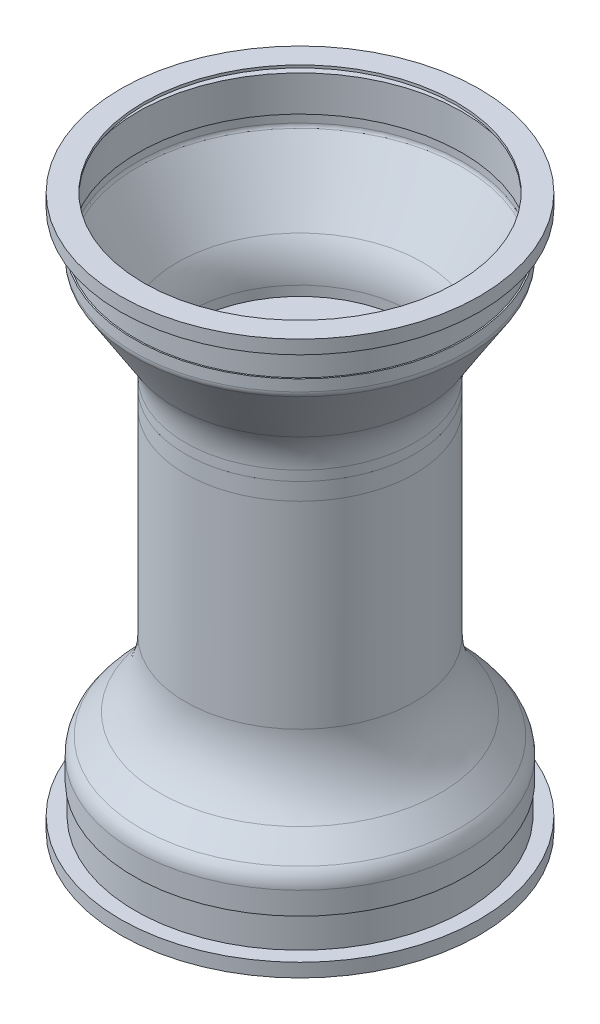
ISO-10303-21;
HEADER;
FILE_DESCRIPTION(('STEP AP214'),'2;1');
FILE_NAME('part.step','',(''),(''),'','','');
FILE_SCHEMA(('AUTOMOTIVE_DESIGN { 1 0 10303 214 1 1 1 1 }'));
ENDSEC;
DATA;
#1=APPLICATION_CONTEXT('core data for automotive mechanical design processes');
#2=APPLICATION_PROTOCOL_DEFINITION('international standard','automotive_design',2000,#1);
#3=PRODUCT_CONTEXT('',#1,'mechanical');
#4=PRODUCT('Part','Part','',(#3));
#5=PRODUCT_RELATED_PRODUCT_CATEGORY('part','',(#4));
#6=PRODUCT_DEFINITION_FORMATION('','',#4);
#7=PRODUCT_DEFINITION_CONTEXT('part definition',#1,'design');
#8=PRODUCT_DEFINITION('design','',#6,#7);
#9=PRODUCT_DEFINITION_SHAPE('','',#8);
#10=(LENGTH_UNIT() NAMED_UNIT(*) SI_UNIT(.MILLI.,.METRE.));
#11=(NAMED_UNIT(*) PLANE_ANGLE_UNIT() SI_UNIT($,.RADIAN.));
#12=(NAMED_UNIT(*) SI_UNIT($,.STERADIAN.) SOLID_ANGLE_UNIT());
#13=UNCERTAINTY_MEASURE_WITH_UNIT(LENGTH_MEASURE(1.E-05),#10,'distance_accuracy_value','');
#14=(GEOMETRIC_REPRESENTATION_CONTEXT(3) GLOBAL_UNCERTAINTY_ASSIGNED_CONTEXT((#13)) GLOBAL_UNIT_ASSIGNED_CONTEXT((#10,
#11,#12)) REPRESENTATION_CONTEXT('',''));
#15=CARTESIAN_POINT('',(0.,0.,0.));
#16=DIRECTION('',(0.,0.,1.));
#17=DIRECTION('',(1.,0.,0.));
#18=AXIS2_PLACEMENT_3D('',#15,#16,#17);
#19=CARTESIAN_POINT('',(0.,208.55,0.));
#20=DIRECTION('',(0.,1.,0.));
#21=DIRECTION('',(0.,0.,1.));
#22=AXIS2_PLACEMENT_3D('',#19,#20,#21);
#23=PLANE('',#22);
#24=CARTESIAN_POINT('',(0.,208.55,0.));
#25=DIRECTION('',(0.,1.,0.));
#26=DIRECTION('',(0.,0.,1.));
#27=AXIS2_PLACEMENT_3D('',#24,#25,#26);
#28=CIRCLE('',#27,59.25);
#29=CARTESIAN_POINT('',(0.,208.55,59.25));
#30=VERTEX_POINT('',#29);
#31=EDGE_CURVE('E70',#30,#30,#28,.T.);
#32=ORIENTED_EDGE('',*,*,#31,.T.);
#33=EDGE_LOOP('',(#32));
#34=FACE_BOUND('',#33,.T.);
#35=CARTESIAN_POINT('',(0.,208.55,0.));
#36=DIRECTION('',(0.,1.,0.));
#37=DIRECTION('',(0.,0.,1.));
#38=AXIS2_PLACEMENT_3D('',#35,#36,#37);
#39=CIRCLE('',#38,67.);
#40=CARTESIAN_POINT('',(0.,208.55,67.));
#41=VERTEX_POINT('',#40);
#42=EDGE_CURVE('E131',#41,#41,#39,.F.);
#43=ORIENTED_EDGE('',*,*,#42,.T.);
#44=EDGE_LOOP('',(#43));
#45=FACE_BOUND('',#44,.T.);
#46=ADVANCED_FACE('F44',(#34,#45),#23,.F.);
#47=CARTESIAN_POINT('',(0.,0.,0.));
#48=DIRECTION('',(0.,-1.,0.));
#49=DIRECTION('',(0.,0.,-1.));
#50=AXIS2_PLACEMENT_3D('',#47,#48,#49);
#51=CYLINDRICAL_SURFACE('',#50,67.);
#52=ORIENTED_EDGE('',*,*,#42,.F.);
#53=EDGE_LOOP('',(#52));
#54=FACE_BOUND('',#53,.T.);
#55=CARTESIAN_POINT('',(0.,205.4,0.));
#56=DIRECTION('',(0.,-1.,0.));
#57=DIRECTION('',(0.,0.,-1.));
#58=AXIS2_PLACEMENT_3D('',#55,#56,#57);
#59=CIRCLE('',#58,67.);
#60=CARTESIAN_POINT('',(0.,205.4,-67.));
#61=VERTEX_POINT('',#60);
#62=EDGE_CURVE('E179',#61,#61,#59,.T.);
#63=ORIENTED_EDGE('',*,*,#62,.T.);
#64=EDGE_LOOP('',(#63));
#65=FACE_BOUND('',#64,.T.);
#66=ADVANCED_FACE('F244',(#54,#65),#51,.F.);
#67=CARTESIAN_POINT('',(68.,205.4,0.));
#68=DIRECTION('',(0.,-1.,0.));
#69=DIRECTION('',(0.,0.,-1.));
#70=AXIS2_PLACEMENT_3D('',#67,#68,#69);
#71=PLANE('',#70);
#72=ORIENTED_EDGE('',*,*,#62,.F.);
#73=EDGE_LOOP('',(#72));
#74=FACE_BOUND('',#73,.T.);
#75=CARTESIAN_POINT('',(0.,205.4,0.));
#76=DIRECTION('',(0.,-1.,0.));
#77=DIRECTION('',(0.,0.,-1.));
#78=AXIS2_PLACEMENT_3D('',#75,#76,#77);
#79=CIRCLE('',#78,61.4);
#80=CARTESIAN_POINT('',(0.,205.4,-61.4));
#81=VERTEX_POINT('',#80);
#82=EDGE_CURVE('E176',#81,#81,#79,.T.);
#83=ORIENTED_EDGE('',*,*,#82,.T.);
#84=EDGE_LOOP('',(#83));
#85=FACE_BOUND('',#84,.T.);
#86=ADVANCED_FACE('F250',(#74,#85),#71,.F.);
#87=CARTESIAN_POINT('',(0.,0.,0.));
#88=DIRECTION('',(0.,-1.,0.));
#89=DIRECTION('',(0.,0.,-1.));
#90=AXIS2_PLACEMENT_3D('',#87,#88,#89);
#91=CYLINDRICAL_SURFACE('',#90,61.4);
#92=ORIENTED_EDGE('',*,*,#82,.F.);
#93=EDGE_LOOP('',(#92));
#94=FACE_BOUND('',#93,.T.);
#95=CARTESIAN_POINT('',(0.,191.9,0.));
#96=DIRECTION('',(0.,1.,0.));
#97=DIRECTION('',(0.,0.,1.));
#98=AXIS2_PLACEMENT_3D('',#95,#96,#97);
#99=CIRCLE('',#98,61.4);
#100=CARTESIAN_POINT('',(0.,191.9,61.4));
#101=VERTEX_POINT('',#100);
#102=EDGE_CURVE('E173',#101,#101,#99,.F.);
#103=ORIENTED_EDGE('',*,*,#102,.T.);
#104=EDGE_LOOP('',(#103));
#105=FACE_BOUND('',#104,.T.);
#106=ADVANCED_FACE('F260',(#94,#105),#91,.F.);
#107=CARTESIAN_POINT('',(62.4,191.9,0.));
#108=DIRECTION('',(0.,1.,0.));
#109=DIRECTION('',(0.,0.,1.));
#110=AXIS2_PLACEMENT_3D('',#107,#108,#109);
#111=PLANE('',#110);
#112=ORIENTED_EDGE('',*,*,#102,.F.);
#113=EDGE_LOOP('',(#112));
#114=FACE_BOUND('',#113,.T.);
#115=CARTESIAN_POINT('',(0.,191.9,0.));
#116=DIRECTION('',(0.,1.,0.));
#117=DIRECTION('',(0.,0.,1.));
#118=AXIS2_PLACEMENT_3D('',#115,#116,#117);
#119=CIRCLE('',#118,61.9);
#120=CARTESIAN_POINT('',(0.,191.9,61.9));
#121=VERTEX_POINT('',#120);
#122=EDGE_CURVE('E170',#121,#121,#119,.F.);
#123=ORIENTED_EDGE('',*,*,#122,.T.);
#124=EDGE_LOOP('',(#123));
#125=FACE_BOUND('',#124,.T.);
#126=ADVANCED_FACE('F264',(#114,#125),#111,.F.);
#127=CARTESIAN_POINT('',(0.,0.,0.));
#128=DIRECTION('',(0.,-1.,0.));
#129=DIRECTION('',(0.,0.,-1.));
#130=AXIS2_PLACEMENT_3D('',#127,#128,#129);
#131=CYLINDRICAL_SURFACE('',#130,61.9);
#132=ORIENTED_EDGE('',*,*,#122,.F.);
#133=EDGE_LOOP('',(#132));
#134=FACE_BOUND('',#133,.T.);
#135=CARTESIAN_POINT('',(0.,188.6,0.));
#136=DIRECTION('',(0.,-1.,0.));
#137=DIRECTION('',(0.,0.,-1.));
#138=AXIS2_PLACEMENT_3D('',#135,#136,#137);
#139=CIRCLE('',#138,61.9);
#140=CARTESIAN_POINT('',(0.,188.6,-61.9));
#141=VERTEX_POINT('',#140);
#142=EDGE_CURVE('E167',#141,#141,#139,.T.);
#143=ORIENTED_EDGE('',*,*,#142,.T.);
#144=EDGE_LOOP('',(#143));
#145=FACE_BOUND('',#144,.T.);
#146=ADVANCED_FACE('F268',(#134,#145),#131,.F.);
#147=CARTESIAN_POINT('',(0.,188.6,0.));
#148=DIRECTION('',(0.,-1.,0.));
#149=DIRECTION('',(0.,0.,-1.));
#150=AXIS2_PLACEMENT_3D('',#147,#148,#149);
#151=TOROIDAL_SURFACE('',#150,59.2205141189999,2.67948588100005);
#152=ORIENTED_EDGE('',*,*,#142,.F.);
#153=EDGE_LOOP('',(#152));
#154=FACE_BOUND('',#153,.T.);
#155=CARTESIAN_POINT('',(0.,187.173061495378,0.));
#156=DIRECTION('',(0.,1.,0.));
#157=DIRECTION('',(0.,0.,1.));
#158=AXIS2_PLACEMENT_3D('',#155,#156,#157);
#159=CIRCLE('',#158,61.4884407250666);
#160=CARTESIAN_POINT('',(0.,187.173061495378,61.4884407250666));
#161=VERTEX_POINT('',#160);
#162=EDGE_CURVE('E164',#161,#161,#159,.F.);
#163=ORIENTED_EDGE('',*,*,#162,.T.);
#164=EDGE_LOOP('',(#163));
#165=FACE_BOUND('',#164,.T.);
#166=ADVANCED_FACE('F272',(#154,#165),#151,.F.);
#167=CARTESIAN_POINT('',(0.,163.392515489979,0.));
#168=DIRECTION('',(0.,1.,0.));
#169=DIRECTION('',(0.,0.,1.));
#170=AXIS2_PLACEMENT_3D('',#167,#168,#169);
#171=CONICAL_SURFACE('',#170,46.5261502059324,0.561600916043491);
#172=ORIENTED_EDGE('',*,*,#162,.F.);
#173=EDGE_LOOP('',(#172));
#174=FACE_BOUND('',#173,.T.);
#175=CARTESIAN_POINT('',(0.,163.392515489979,0.));
#176=DIRECTION('',(0.,-1.,0.));
#177=DIRECTION('',(0.,0.,-1.));
#178=AXIS2_PLACEMENT_3D('',#175,#176,#177);
#179=CIRCLE('',#178,46.5261502059324);
#180=CARTESIAN_POINT('',(0.,163.392515489979,-46.5261502059324));
#181=VERTEX_POINT('',#180);
#182=EDGE_CURVE('E161',#181,#181,#179,.T.);
#183=ORIENTED_EDGE('',*,*,#182,.T.);
#184=EDGE_LOOP('',(#183));
#185=FACE_BOUND('',#184,.T.);
#186=ADVANCED_FACE('F276',(#174,#185),#171,.F.);
#187=CARTESIAN_POINT('',(0.,149.204409301659,0.));
#188=DIRECTION('',(0.,-1.,0.));
#189=DIRECTION('',(0.,0.,-1.));
#190=AXIS2_PLACEMENT_3D('',#187,#188,#189);
#191=TOROIDAL_SURFACE('',#190,69.0762344667182,26.6422344667182);
#192=ORIENTED_EDGE('',*,*,#182,.F.);
#193=EDGE_LOOP('',(#192));
#194=FACE_BOUND('',#193,.T.);
#195=CARTESIAN_POINT('',(0.,149.204409301659,0.));
#196=DIRECTION('',(0.,-1.,0.));
#197=DIRECTION('',(0.,0.,-1.));
#198=AXIS2_PLACEMENT_3D('',#195,#196,#197);
#199=CIRCLE('',#198,42.434);
#200=CARTESIAN_POINT('',(0.,149.204409301659,-42.434));
#201=VERTEX_POINT('',#200);
#202=EDGE_CURVE('E158',#201,#201,#199,.T.);
#203=ORIENTED_EDGE('',*,*,#202,.T.);
#204=EDGE_LOOP('',(#203));
#205=FACE_BOUND('',#204,.T.);
#206=ADVANCED_FACE('F280',(#194,#205),#191,.T.);
#207=CARTESIAN_POINT('',(0.,0.,0.));
#208=DIRECTION('',(0.,-1.,0.));
#209=DIRECTION('',(0.,0.,-1.));
#210=AXIS2_PLACEMENT_3D('',#207,#208,#209);
#211=CYLINDRICAL_SURFACE('',#210,42.434);
#212=CARTESIAN_POINT('',(0.,145.5,0.));
#213=DIRECTION('',(0.,1.,0.));
#214=DIRECTION('',(0.,0.,1.));
#215=AXIS2_PLACEMENT_3D('',#212,#213,#214);
#216=CIRCLE('',#215,42.434);
#217=CARTESIAN_POINT('',(0.,145.5,42.434));
#218=VERTEX_POINT('',#217);
#219=EDGE_CURVE('E63',#218,#218,#216,.F.);
#220=ORIENTED_EDGE('',*,*,#219,.T.);
#221=EDGE_LOOP('',(#220));
#222=FACE_BOUND('',#221,.T.);
#223=ORIENTED_EDGE('',*,*,#202,.F.);
#224=EDGE_LOOP('',(#223));
#225=FACE_BOUND('',#224,.T.);
#226=ADVANCED_FACE('F284',(#222,#225),#211,.F.);
#227=CARTESIAN_POINT('',(0.,209.55,0.));
#228=DIRECTION('',(0.,1.,0.));
#229=DIRECTION('',(0.,0.,1.));
#230=AXIS2_PLACEMENT_3D('',#227,#228,#229);
#231=PLANE('',#230);
#232=CARTESIAN_POINT('',(0.,209.55,0.));
#233=DIRECTION('',(0.,1.,0.));
#234=DIRECTION('',(0.,0.,1.));
#235=AXIS2_PLACEMENT_3D('',#232,#233,#234);
#236=CIRCLE('',#235,59.25);
#237=CARTESIAN_POINT('',(0.,209.55,59.25));
#238=VERTEX_POINT('',#237);
#239=EDGE_CURVE('E66',#238,#238,#236,.T.);
#240=ORIENTED_EDGE('',*,*,#239,.F.);
#241=EDGE_LOOP('',(#240));
#242=FACE_BOUND('',#241,.T.);
#243=CARTESIAN_POINT('',(0.,209.55,0.));
#244=DIRECTION('',(0.,-1.,0.));
#245=DIRECTION('',(0.,0.,-1.));
#246=AXIS2_PLACEMENT_3D('',#243,#244,#245);
#247=CIRCLE('',#246,68.);
#248=CARTESIAN_POINT('',(0.,209.55,-68.));
#249=VERTEX_POINT('',#248);
#250=EDGE_CURVE('E128',#249,#249,#247,.T.);
#251=ORIENTED_EDGE('',*,*,#250,.F.);
#252=EDGE_LOOP('',(#251));
#253=FACE_BOUND('',#252,.T.);
#254=ADVANCED_FACE('F255',(#242,#253),#231,.T.);
#255=CARTESIAN_POINT('',(0.,0.,0.));
#256=DIRECTION('',(0.,-1.,0.));
#257=DIRECTION('',(0.,0.,-1.));
#258=AXIS2_PLACEMENT_3D('',#255,#256,#257);
#259=CYLINDRICAL_SURFACE('',#258,68.);
#260=ORIENTED_EDGE('',*,*,#250,.T.);
#261=EDGE_LOOP('',(#260));
#262=FACE_BOUND('',#261,.T.);
#263=CARTESIAN_POINT('',(0.,204.4,0.));
#264=DIRECTION('',(0.,-1.,0.));
#265=DIRECTION('',(0.,0.,-1.));
#266=AXIS2_PLACEMENT_3D('',#263,#264,#265);
#267=CIRCLE('',#266,68.);
#268=CARTESIAN_POINT('',(0.,204.4,-68.));
#269=VERTEX_POINT('',#268);
#270=EDGE_CURVE('E125',#269,#269,#267,.T.);
#271=ORIENTED_EDGE('',*,*,#270,.F.);
#272=EDGE_LOOP('',(#271));
#273=FACE_BOUND('',#272,.T.);
#274=ADVANCED_FACE('F410',(#262,#273),#259,.T.);
#275=CARTESIAN_POINT('',(68.,204.4,0.));
#276=DIRECTION('',(0.,-1.,0.));
#277=DIRECTION('',(0.,0.,-1.));
#278=AXIS2_PLACEMENT_3D('',#275,#276,#277);
#279=PLANE('',#278);
#280=ORIENTED_EDGE('',*,*,#270,.T.);
#281=EDGE_LOOP('',(#280));
#282=FACE_BOUND('',#281,.T.);
#283=CARTESIAN_POINT('',(0.,204.4,0.));
#284=DIRECTION('',(0.,-1.,0.));
#285=DIRECTION('',(0.,0.,-1.));
#286=AXIS2_PLACEMENT_3D('',#283,#284,#285);
#287=CIRCLE('',#286,62.4);
#288=CARTESIAN_POINT('',(0.,204.4,-62.4));
#289=VERTEX_POINT('',#288);
#290=EDGE_CURVE('E122',#289,#289,#287,.T.);
#291=ORIENTED_EDGE('',*,*,#290,.F.);
#292=EDGE_LOOP('',(#291));
#293=FACE_BOUND('',#292,.T.);
#294=ADVANCED_FACE('F407',(#282,#293),#279,.T.);
#295=CARTESIAN_POINT('',(0.,0.,0.));
#296=DIRECTION('',(0.,-1.,0.));
#297=DIRECTION('',(0.,0.,-1.));
#298=AXIS2_PLACEMENT_3D('',#295,#296,#297);
#299=CYLINDRICAL_SURFACE('',#298,62.4);
#300=ORIENTED_EDGE('',*,*,#290,.T.);
#301=EDGE_LOOP('',(#300));
#302=FACE_BOUND('',#301,.T.);
#303=CARTESIAN_POINT('',(0.,192.9,0.));
#304=DIRECTION('',(0.,-1.,0.));
#305=DIRECTION('',(0.,0.,-1.));
#306=AXIS2_PLACEMENT_3D('',#303,#304,#305);
#307=CIRCLE('',#306,62.4);
#308=CARTESIAN_POINT('',(0.,192.9,-62.4));
#309=VERTEX_POINT('',#308);
#310=EDGE_CURVE('E119',#309,#309,#307,.T.);
#311=ORIENTED_EDGE('',*,*,#310,.F.);
#312=EDGE_LOOP('',(#311));
#313=FACE_BOUND('',#312,.T.);
#314=ADVANCED_FACE('F403',(#302,#313),#299,.T.);
#315=CARTESIAN_POINT('',(62.4,192.9,0.));
#316=DIRECTION('',(0.,1.,0.));
#317=DIRECTION('',(0.,0.,1.));
#318=AXIS2_PLACEMENT_3D('',#315,#316,#317);
#319=PLANE('',#318);
#320=ORIENTED_EDGE('',*,*,#310,.T.);
#321=EDGE_LOOP('',(#320));
#322=FACE_BOUND('',#321,.T.);
#323=CARTESIAN_POINT('',(0.,192.9,0.));
#324=DIRECTION('',(0.,-1.,0.));
#325=DIRECTION('',(0.,0.,-1.));
#326=AXIS2_PLACEMENT_3D('',#323,#324,#325);
#327=CIRCLE('',#326,62.9);
#328=CARTESIAN_POINT('',(0.,192.9,-62.9));
#329=VERTEX_POINT('',#328);
#330=EDGE_CURVE('E116',#329,#329,#327,.T.);
#331=ORIENTED_EDGE('',*,*,#330,.F.);
#332=EDGE_LOOP('',(#331));
#333=FACE_BOUND('',#332,.T.);
#334=ADVANCED_FACE('F399',(#322,#333),#319,.T.);
#335=CARTESIAN_POINT('',(0.,0.,0.));
#336=DIRECTION('',(0.,-1.,0.));
#337=DIRECTION('',(0.,0.,-1.));
#338=AXIS2_PLACEMENT_3D('',#335,#336,#337);
#339=CYLINDRICAL_SURFACE('',#338,62.9);
#340=ORIENTED_EDGE('',*,*,#330,.T.);
#341=EDGE_LOOP('',(#340));
#342=FACE_BOUND('',#341,.T.);
#343=CARTESIAN_POINT('',(0.,188.6,0.));
#344=DIRECTION('',(0.,-1.,0.));
#345=DIRECTION('',(0.,0.,-1.));
#346=AXIS2_PLACEMENT_3D('',#343,#344,#345);
#347=CIRCLE('',#346,62.9);
#348=CARTESIAN_POINT('',(0.,188.6,-62.9));
#349=VERTEX_POINT('',#348);
#350=EDGE_CURVE('E113',#349,#349,#347,.T.);
#351=ORIENTED_EDGE('',*,*,#350,.F.);
#352=EDGE_LOOP('',(#351));
#353=FACE_BOUND('',#352,.T.);
#354=ADVANCED_FACE('F395',(#342,#353),#339,.T.);
#355=CARTESIAN_POINT('',(0.,188.6,0.));
#356=DIRECTION('',(0.,-1.,0.));
#357=DIRECTION('',(0.,0.,-1.));
#358=AXIS2_PLACEMENT_3D('',#355,#356,#357);
#359=TOROIDAL_SURFACE('',#358,59.2205141189999,3.67948588100005);
#360=ORIENTED_EDGE('',*,*,#350,.T.);
#361=EDGE_LOOP('',(#360));
#362=FACE_BOUND('',#361,.T.);
#363=CARTESIAN_POINT('',(0.,186.640519594433,0.));
#364=DIRECTION('',(0.,-1.,0.));
#365=DIRECTION('',(0.,0.,-1.));
#366=AXIS2_PLACEMENT_3D('',#363,#364,#365);
#367=CIRCLE('',#366,62.3348443662085);
#368=CARTESIAN_POINT('',(0.,186.640519594433,-62.3348443662085));
#369=VERTEX_POINT('',#368);
#370=EDGE_CURVE('E110',#369,#369,#367,.T.);
#371=ORIENTED_EDGE('',*,*,#370,.F.);
#372=EDGE_LOOP('',(#371));
#373=FACE_BOUND('',#372,.T.);
#374=ADVANCED_FACE('F391',(#362,#373),#359,.T.);
#375=CARTESIAN_POINT('',(0.,162.859973589035,0.));
#376=DIRECTION('',(0.,1.,0.));
#377=DIRECTION('',(0.,0.,1.));
#378=AXIS2_PLACEMENT_3D('',#375,#376,#377);
#379=CONICAL_SURFACE('',#378,47.3725538470743,0.561600916043491);
#380=ORIENTED_EDGE('',*,*,#370,.T.);
#381=EDGE_LOOP('',(#380));
#382=FACE_BOUND('',#381,.T.);
#383=CARTESIAN_POINT('',(0.,162.859973589035,0.));
#384=DIRECTION('',(0.,-1.,0.));
#385=DIRECTION('',(0.,0.,-1.));
#386=AXIS2_PLACEMENT_3D('',#383,#384,#385);
#387=CIRCLE('',#386,47.3725538470743);
#388=CARTESIAN_POINT('',(0.,162.859973589035,-47.3725538470743));
#389=VERTEX_POINT('',#388);
#390=EDGE_CURVE('E107',#389,#389,#387,.T.);
#391=ORIENTED_EDGE('',*,*,#390,.F.);
#392=EDGE_LOOP('',(#391));
#393=FACE_BOUND('',#392,.T.);
#394=ADVANCED_FACE('F387',(#382,#393),#379,.T.);
#395=CARTESIAN_POINT('',(0.,149.204409301659,0.));
#396=DIRECTION('',(0.,-1.,0.));
#397=DIRECTION('',(0.,0.,-1.));
#398=AXIS2_PLACEMENT_3D('',#395,#396,#397);
#399=TOROIDAL_SURFACE('',#398,69.0762344667182,25.6422344667182);
#400=ORIENTED_EDGE('',*,*,#390,.T.);
#401=EDGE_LOOP('',(#400));
#402=FACE_BOUND('',#401,.T.);
#403=CARTESIAN_POINT('',(0.,149.204409301659,0.));
#404=DIRECTION('',(0.,-1.,0.));
#405=DIRECTION('',(0.,0.,-1.));
#406=AXIS2_PLACEMENT_3D('',#403,#404,#405);
#407=CIRCLE('',#406,43.434);
#408=CARTESIAN_POINT('',(0.,149.204409301659,-43.434));
#409=VERTEX_POINT('',#408);
#410=EDGE_CURVE('E104',#409,#409,#407,.T.);
#411=ORIENTED_EDGE('',*,*,#410,.F.);
#412=EDGE_LOOP('',(#411));
#413=FACE_BOUND('',#412,.T.);
#414=ADVANCED_FACE('F383',(#402,#413),#399,.F.);
#415=CARTESIAN_POINT('',(0.,0.,0.));
#416=DIRECTION('',(0.,-1.,0.));
#417=DIRECTION('',(0.,0.,-1.));
#418=AXIS2_PLACEMENT_3D('',#415,#416,#417);
#419=CYLINDRICAL_SURFACE('',#418,43.434);
#420=CARTESIAN_POINT('',(0.,145.5,0.));
#421=DIRECTION('',(0.,1.,0.));
#422=DIRECTION('',(0.,0.,1.));
#423=AXIS2_PLACEMENT_3D('',#420,#421,#422);
#424=CIRCLE('',#423,43.434);
#425=CARTESIAN_POINT('',(0.,145.5,43.434));
#426=VERTEX_POINT('',#425);
#427=EDGE_CURVE('E52',#426,#426,#424,.F.);
#428=ORIENTED_EDGE('',*,*,#427,.F.);
#429=EDGE_LOOP('',(#428));
#430=FACE_BOUND('',#429,.T.);
#431=ORIENTED_EDGE('',*,*,#410,.T.);
#432=EDGE_LOOP('',(#431));
#433=FACE_BOUND('',#432,.T.);
#434=ADVANCED_FACE('F234',(#430,#433),#419,.T.);
#435=CARTESIAN_POINT('',(0.,204.05,0.));
#436=DIRECTION('',(0.,1.,0.));
#437=DIRECTION('',(0.,0.,1.));
#438=AXIS2_PLACEMENT_3D('',#435,#436,#437);
#439=CYLINDRICAL_SURFACE('',#438,59.25);
#440=ORIENTED_EDGE('',*,*,#239,.T.);
#441=EDGE_LOOP('',(#440));
#442=FACE_BOUND('',#441,.T.);
#443=ORIENTED_EDGE('',*,*,#31,.F.);
#444=EDGE_LOOP('',(#443));
#445=FACE_BOUND('',#444,.T.);
#446=ADVANCED_FACE('F223',(#442,#445),#439,.F.);
#447=CARTESIAN_POINT('',(0.,139.,0.));
#448=DIRECTION('',(0.,1.,0.));
#449=DIRECTION('',(0.,0.,1.));
#450=AXIS2_PLACEMENT_3D('',#447,#448,#449);
#451=PLANE('',#450);
#452=CARTESIAN_POINT('',(0.,139.,0.));
#453=DIRECTION('',(0.,1.,0.));
#454=DIRECTION('',(0.,0.,1.));
#455=AXIS2_PLACEMENT_3D('',#452,#453,#454);
#456=CIRCLE('',#455,43.434);
#457=CARTESIAN_POINT('',(0.,139.,43.434));
#458=VERTEX_POINT('',#457);
#459=EDGE_CURVE('E67',#458,#458,#456,.F.);
#460=ORIENTED_EDGE('',*,*,#459,.F.);
#461=EDGE_LOOP('',(#460));
#462=FACE_BOUND('',#461,.T.);
#463=CARTESIAN_POINT('',(0.,139.,0.));
#464=DIRECTION('',(0.,1.,0.));
#465=DIRECTION('',(0.,0.,1.));
#466=AXIS2_PLACEMENT_3D('',#463,#464,#465);
#467=CIRCLE('',#466,43.435);
#468=CARTESIAN_POINT('',(0.,139.,-43.435));
#469=VERTEX_POINT('',#468);
#470=EDGE_CURVE('E61',#469,#469,#467,.T.);
#471=ORIENTED_EDGE('',*,*,#470,.F.);
#472=EDGE_LOOP('',(#471));
#473=FACE_BOUND('',#472,.T.);
#474=ADVANCED_FACE('F220',(#462,#473),#451,.F.);
#475=CARTESIAN_POINT('',(0.,145.5,0.));
#476=DIRECTION('',(0.,1.,0.));
#477=DIRECTION('',(0.,0.,1.));
#478=AXIS2_PLACEMENT_3D('',#475,#476,#477);
#479=PLANE('',#478);
#480=ORIENTED_EDGE('',*,*,#427,.T.);
#481=EDGE_LOOP('',(#480));
#482=FACE_BOUND('',#481,.T.);
#483=CARTESIAN_POINT('',(0.,145.5,0.));
#484=DIRECTION('',(0.,1.,0.));
#485=DIRECTION('',(0.,0.,1.));
#486=AXIS2_PLACEMENT_3D('',#483,#484,#485);
#487=CIRCLE('',#486,43.435);
#488=CARTESIAN_POINT('',(0.,145.5,-43.435));
#489=VERTEX_POINT('',#488);
#490=EDGE_CURVE('E187',#489,#489,#487,.T.);
#491=ORIENTED_EDGE('',*,*,#490,.T.);
#492=EDGE_LOOP('',(#491));
#493=FACE_BOUND('',#492,.T.);
#494=ADVANCED_FACE('F222',(#482,#493),#479,.T.);
#495=CARTESIAN_POINT('',(0.,145.5,0.));
#496=DIRECTION('',(0.,-1.,0.));
#497=DIRECTION('',(0.,0.,-1.));
#498=AXIS2_PLACEMENT_3D('',#495,#496,#497);
#499=CYLINDRICAL_SURFACE('',#498,43.435);
#500=CARTESIAN_POINT('',(0.,145.5,-43.435));
#501=CARTESIAN_POINT('',(0.,145.432291666667,-43.435));
#502=CARTESIAN_POINT('',(0.,145.364583333333,-43.435));
#503=CARTESIAN_POINT('',(0.,145.229166666667,-43.435));
#504=CARTESIAN_POINT('',(0.,145.161458333333,-43.435));
#505=CARTESIAN_POINT('',(0.,145.026041666667,-43.435));
#506=CARTESIAN_POINT('',(0.,144.958333333333,-43.435));
#507=CARTESIAN_POINT('',(0.,144.822916666667,-43.435));
#508=CARTESIAN_POINT('',(0.,144.755208333333,-43.435));
#509=CARTESIAN_POINT('',(0.,144.619791666667,-43.435));
#510=CARTESIAN_POINT('',(0.,144.552083333333,-43.435));
#511=CARTESIAN_POINT('',(0.,144.416666666667,-43.435));
#512=CARTESIAN_POINT('',(0.,144.348958333333,-43.435));
#513=CARTESIAN_POINT('',(0.,144.213541666667,-43.435));
#514=CARTESIAN_POINT('',(0.,144.145833333333,-43.435));
#515=CARTESIAN_POINT('',(0.,144.010416666667,-43.435));
#516=CARTESIAN_POINT('',(0.,143.942708333333,-43.435));
#517=CARTESIAN_POINT('',(0.,143.807291666667,-43.435));
#518=CARTESIAN_POINT('',(0.,143.739583333333,-43.435));
#519=CARTESIAN_POINT('',(0.,143.604166666667,-43.435));
#520=CARTESIAN_POINT('',(0.,143.536458333333,-43.435));
#521=CARTESIAN_POINT('',(0.,143.401041666667,-43.435));
#522=CARTESIAN_POINT('',(0.,143.333333333333,-43.435));
#523=CARTESIAN_POINT('',(0.,143.197916666667,-43.435));
#524=CARTESIAN_POINT('',(0.,143.130208333333,-43.435));
#525=CARTESIAN_POINT('',(0.,142.994791666667,-43.435));
#526=CARTESIAN_POINT('',(0.,142.927083333333,-43.435));
#527=CARTESIAN_POINT('',(0.,142.791666666667,-43.435));
#528=CARTESIAN_POINT('',(0.,142.723958333333,-43.435));
#529=CARTESIAN_POINT('',(0.,142.588541666667,-43.435));
#530=CARTESIAN_POINT('',(0.,142.520833333333,-43.435));
#531=CARTESIAN_POINT('',(0.,142.385416666667,-43.435));
#532=CARTESIAN_POINT('',(0.,142.317708333333,-43.435));
#533=CARTESIAN_POINT('',(0.,142.182291666667,-43.435));
#534=CARTESIAN_POINT('',(0.,142.114583333333,-43.435));
#535=CARTESIAN_POINT('',(0.,141.979166666667,-43.435));
#536=CARTESIAN_POINT('',(0.,141.911458333333,-43.435));
#537=CARTESIAN_POINT('',(0.,141.776041666667,-43.435));
#538=CARTESIAN_POINT('',(0.,141.708333333333,-43.435));
#539=CARTESIAN_POINT('',(0.,141.572916666667,-43.435));
#540=CARTESIAN_POINT('',(0.,141.505208333333,-43.435));
#541=CARTESIAN_POINT('',(0.,141.369791666667,-43.435));
#542=CARTESIAN_POINT('',(0.,141.302083333333,-43.435));
#543=CARTESIAN_POINT('',(0.,141.166666666667,-43.435));
#544=CARTESIAN_POINT('',(0.,141.098958333333,-43.435));
#545=CARTESIAN_POINT('',(0.,140.963541666667,-43.435));
#546=CARTESIAN_POINT('',(0.,140.895833333333,-43.435));
#547=CARTESIAN_POINT('',(0.,140.760416666667,-43.435));
#548=CARTESIAN_POINT('',(0.,140.692708333333,-43.435));
#549=CARTESIAN_POINT('',(0.,140.557291666667,-43.435));
#550=CARTESIAN_POINT('',(0.,140.489583333333,-43.435));
#551=CARTESIAN_POINT('',(0.,140.354166666667,-43.435));
#552=CARTESIAN_POINT('',(0.,140.286458333333,-43.435));
#553=CARTESIAN_POINT('',(0.,140.151041666667,-43.435));
#554=CARTESIAN_POINT('',(0.,140.083333333333,-43.435));
#555=CARTESIAN_POINT('',(0.,139.947916666667,-43.435));
#556=CARTESIAN_POINT('',(0.,139.880208333333,-43.435));
#557=CARTESIAN_POINT('',(0.,139.744791666667,-43.435));
#558=CARTESIAN_POINT('',(0.,139.677083333333,-43.435));
#559=CARTESIAN_POINT('',(0.,139.541666666667,-43.435));
#560=CARTESIAN_POINT('',(0.,139.473958333333,-43.435));
#561=CARTESIAN_POINT('',(0.,139.338541666667,-43.435));
#562=CARTESIAN_POINT('',(0.,139.270833333333,-43.435));
#563=CARTESIAN_POINT('',(0.,139.135416666667,-43.435));
#564=CARTESIAN_POINT('',(0.,139.067708333333,-43.435));
#565=CARTESIAN_POINT('',(0.,139.,-43.435));
#566=B_SPLINE_CURVE_WITH_KNOTS('',3,(#500,#501,#502,#503,#504,#505,#506,#507,#508,#509,#510,
#511,#512,#513,#514,#515,#516,#517,#518,#519,#520,#521,#522,#523,#524,#525,#526,#527,#528,#529,
#530,#531,#532,#533,#534,#535,#536,#537,#538,#539,#540,#541,#542,#543,#544,#545,#546,#547,#548,
#549,#550,#551,#552,#553,#554,#555,#556,#557,#558,#559,#560,#561,#562,#563,#564,#565),
.UNSPECIFIED.,.F.,.F.,(4,2,2,2,2,2,2,2,2,2,2,2,2,2,2,2,2,2,2,2,2,2,2,2,2,2,2,2,2,2,2,2,4),(0.,
0.203124999999998,0.406249999999997,0.609374999999995,0.812499999999994,1.01562499999999,
1.21874999999999,1.42187499999999,1.62499999999999,1.82812499999999,2.03124999999998,
2.23437499999998,2.43749999999998,2.64062499999998,2.84374999999998,3.04687499999998,3.25,
3.453125,3.65625,3.859375,4.0625,4.26562499999999,4.46874999999999,4.67187499999999,
4.87499999999999,5.07812499999999,5.28124999999999,5.48437499999999,5.68749999999998,
5.89062499999998,6.09374999999998,6.29687499999998,6.50000000000001),.UNSPECIFIED.);
#567=EDGE_CURVE('BSEAM218',#489,#469,#566,.T.);
#568=ORIENTED_EDGE('',*,*,#490,.F.);
#569=ORIENTED_EDGE('',*,*,#470,.T.);
#570=ORIENTED_EDGE('',*,*,#567,.T.);
#571=ORIENTED_EDGE('',*,*,#567,.F.);
#572=EDGE_LOOP('',(#568,#570,#569,#571));
#573=FACE_BOUND('',#572,.T.);
#574=ADVANCED_FACE('F218',(#573),#499,.T.);
#575=CARTESIAN_POINT('',(24.7466759131403,145.5,14.2875000000001));
#576=DIRECTION('',(0.,1.,0.));
#577=DIRECTION('',(0.,0.,1.));
#578=AXIS2_PLACEMENT_3D('',#575,#576,#577);
#579=CIRCLE('',#578,4.7625);
#580=CARTESIAN_POINT('',(24.7466759131403,145.5,19.0500000000001));
#581=VERTEX_POINT('',#580);
#582=EDGE_CURVE('E193',#581,#581,#579,.T.);
#583=ORIENTED_EDGE('',*,*,#582,.F.);
#584=EDGE_LOOP('',(#583));
#585=FACE_BOUND('',#584,.T.);
#586=CARTESIAN_POINT('',(0.,145.5,-28.575));
#587=DIRECTION('',(0.,1.,0.));
#588=DIRECTION('',(0.,0.,1.));
#589=AXIS2_PLACEMENT_3D('',#586,#587,#588);
#590=CIRCLE('',#589,4.7625);
#591=CARTESIAN_POINT('',(0.,145.5,-23.8125));
#592=VERTEX_POINT('',#591);
#593=EDGE_CURVE('E199',#592,#592,#590,.T.);
#594=ORIENTED_EDGE('',*,*,#593,.F.);
#595=EDGE_LOOP('',(#594));
#596=FACE_BOUND('',#595,.T.);
#597=CARTESIAN_POINT('',(-24.7466759131403,145.5,14.2875000000001));
#598=DIRECTION('',(0.,1.,0.));
#599=DIRECTION('',(0.,0.,1.));
#600=AXIS2_PLACEMENT_3D('',#597,#598,#599);
#601=CIRCLE('',#600,4.7625);
#602=CARTESIAN_POINT('',(-24.7466759131403,145.5,19.0500000000001));
#603=VERTEX_POINT('',#602);
#604=EDGE_CURVE('E196',#603,#603,#601,.T.);
#605=ORIENTED_EDGE('',*,*,#604,.F.);
#606=EDGE_LOOP('',(#605));
#607=FACE_BOUND('',#606,.T.);
#608=CARTESIAN_POINT('',(0.,145.5,0.));
#609=DIRECTION('',(0.,1.,0.));
#610=DIRECTION('',(0.,0.,1.));
#611=AXIS2_PLACEMENT_3D('',#608,#609,#610);
#612=CIRCLE('',#611,19.84375);
#613=CARTESIAN_POINT('',(0.,145.5,19.84375));
#614=VERTEX_POINT('',#613);
#615=EDGE_CURVE('E192',#614,#614,#612,.T.);
#616=ORIENTED_EDGE('',*,*,#615,.F.);
#617=EDGE_LOOP('',(#616));
#618=FACE_BOUND('',#617,.T.);
#619=ORIENTED_EDGE('',*,*,#219,.F.);
#620=EDGE_LOOP('',(#619));
#621=FACE_BOUND('',#620,.T.);
#622=ADVANCED_FACE('F233',(#585,#596,#607,#618,#621),#479,.T.);
#623=CARTESIAN_POINT('',(68.,1.,0.));
#624=DIRECTION('',(0.,-1.,0.));
#625=DIRECTION('',(0.,0.,-1.));
#626=AXIS2_PLACEMENT_3D('',#623,#624,#625);
#627=PLANE('',#626);
#628=CARTESIAN_POINT('',(0.,1.,0.));
#629=DIRECTION('',(0.,-1.,0.));
#630=DIRECTION('',(0.,0.,-1.));
#631=AXIS2_PLACEMENT_3D('',#628,#629,#630);
#632=CIRCLE('',#631,59.25);
#633=CARTESIAN_POINT('',(0.,1.,-59.25));
#634=VERTEX_POINT('',#633);
#635=EDGE_CURVE('E76',#634,#634,#632,.T.);
#636=ORIENTED_EDGE('',*,*,#635,.T.);
#637=EDGE_LOOP('',(#636));
#638=FACE_BOUND('',#637,.T.);
#639=CARTESIAN_POINT('',(0.,1.,0.));
#640=DIRECTION('',(0.,-1.,0.));
#641=DIRECTION('',(0.,0.,-1.));
#642=AXIS2_PLACEMENT_3D('',#639,#640,#641);
#643=CIRCLE('',#642,67.);
#644=CARTESIAN_POINT('',(0.,1.,-67.));
#645=VERTEX_POINT('',#644);
#646=EDGE_CURVE('E57',#645,#645,#643,.T.);
#647=ORIENTED_EDGE('',*,*,#646,.F.);
#648=EDGE_LOOP('',(#647));
#649=FACE_BOUND('',#648,.T.);
#650=ADVANCED_FACE('F46',(#638,#649),#627,.F.);
#651=CARTESIAN_POINT('',(0.,0.,0.));
#652=DIRECTION('',(0.,-1.,0.));
#653=DIRECTION('',(0.,0.,-1.));
#654=AXIS2_PLACEMENT_3D('',#651,#652,#653);
#655=CYLINDRICAL_SURFACE('',#654,67.);
#656=CARTESIAN_POINT('',(0.,4.15,0.));
#657=DIRECTION('',(0.,1.,0.));
#658=DIRECTION('',(0.,0.,1.));
#659=AXIS2_PLACEMENT_3D('',#656,#657,#658);
#660=CIRCLE('',#659,67.);
#661=CARTESIAN_POINT('',(0.,4.15,67.));
#662=VERTEX_POINT('',#661);
#663=EDGE_CURVE('E134',#662,#662,#660,.F.);
#664=ORIENTED_EDGE('',*,*,#663,.F.);
#665=EDGE_LOOP('',(#664));
#666=FACE_BOUND('',#665,.T.);
#667=ORIENTED_EDGE('',*,*,#646,.T.);
#668=EDGE_LOOP('',(#667));
#669=FACE_BOUND('',#668,.T.);
#670=ADVANCED_FACE('F316',(#666,#669),#655,.F.);
#671=CARTESIAN_POINT('',(62.4,4.15,0.));
#672=DIRECTION('',(0.,1.,0.));
#673=DIRECTION('',(0.,0.,1.));
#674=AXIS2_PLACEMENT_3D('',#671,#672,#673);
#675=PLANE('',#674);
#676=CARTESIAN_POINT('',(0.,4.15,0.));
#677=DIRECTION('',(0.,1.,0.));
#678=DIRECTION('',(0.,0.,1.));
#679=AXIS2_PLACEMENT_3D('',#676,#677,#678);
#680=CIRCLE('',#679,61.4);
#681=CARTESIAN_POINT('',(0.,4.15,61.4));
#682=VERTEX_POINT('',#681);
#683=EDGE_CURVE('E137',#682,#682,#680,.F.);
#684=ORIENTED_EDGE('',*,*,#683,.F.);
#685=EDGE_LOOP('',(#684));
#686=FACE_BOUND('',#685,.T.);
#687=ORIENTED_EDGE('',*,*,#663,.T.);
#688=EDGE_LOOP('',(#687));
#689=FACE_BOUND('',#688,.T.);
#690=ADVANCED_FACE('F313',(#686,#689),#675,.F.);
#691=CARTESIAN_POINT('',(0.,0.,0.));
#692=DIRECTION('',(0.,-1.,0.));
#693=DIRECTION('',(0.,0.,-1.));
#694=AXIS2_PLACEMENT_3D('',#691,#692,#693);
#695=CYLINDRICAL_SURFACE('',#694,61.4);
#696=CARTESIAN_POINT('',(0.,17.65,0.));
#697=DIRECTION('',(0.,-1.,0.));
#698=DIRECTION('',(0.,0.,-1.));
#699=AXIS2_PLACEMENT_3D('',#696,#697,#698);
#700=CIRCLE('',#699,61.4);
#701=CARTESIAN_POINT('',(0.,17.65,-61.4));
#702=VERTEX_POINT('',#701);
#703=EDGE_CURVE('E140',#702,#702,#700,.T.);
#704=ORIENTED_EDGE('',*,*,#703,.F.);
#705=EDGE_LOOP('',(#704));
#706=FACE_BOUND('',#705,.T.);
#707=ORIENTED_EDGE('',*,*,#683,.T.);
#708=EDGE_LOOP('',(#707));
#709=FACE_BOUND('',#708,.T.);
#710=ADVANCED_FACE('F309',(#706,#709),#695,.F.);
#711=CARTESIAN_POINT('',(62.4,17.65,0.));
#712=DIRECTION('',(0.,-1.,0.));
#713=DIRECTION('',(0.,0.,-1.));
#714=AXIS2_PLACEMENT_3D('',#711,#712,#713);
#715=PLANE('',#714);
#716=CARTESIAN_POINT('',(0.,17.65,0.));
#717=DIRECTION('',(0.,-1.,0.));
#718=DIRECTION('',(0.,0.,-1.));
#719=AXIS2_PLACEMENT_3D('',#716,#717,#718);
#720=CIRCLE('',#719,61.9);
#721=CARTESIAN_POINT('',(0.,17.65,-61.9));
#722=VERTEX_POINT('',#721);
#723=EDGE_CURVE('E143',#722,#722,#720,.T.);
#724=ORIENTED_EDGE('',*,*,#723,.F.);
#725=EDGE_LOOP('',(#724));
#726=FACE_BOUND('',#725,.T.);
#727=ORIENTED_EDGE('',*,*,#703,.T.);
#728=EDGE_LOOP('',(#727));
#729=FACE_BOUND('',#728,.T.);
#730=ADVANCED_FACE('F305',(#726,#729),#715,.F.);
#731=CARTESIAN_POINT('',(0.,0.,0.));
#732=DIRECTION('',(0.,-1.,0.));
#733=DIRECTION('',(0.,0.,-1.));
#734=AXIS2_PLACEMENT_3D('',#731,#732,#733);
#735=CYLINDRICAL_SURFACE('',#734,61.9);
#736=CARTESIAN_POINT('',(0.,25.15,0.));
#737=DIRECTION('',(0.,-1.,0.));
#738=DIRECTION('',(0.,0.,-1.));
#739=AXIS2_PLACEMENT_3D('',#736,#737,#738);
#740=CIRCLE('',#739,61.9);
#741=CARTESIAN_POINT('',(0.,25.15,-61.9));
#742=VERTEX_POINT('',#741);
#743=EDGE_CURVE('E146',#742,#742,#740,.T.);
#744=ORIENTED_EDGE('',*,*,#743,.F.);
#745=EDGE_LOOP('',(#744));
#746=FACE_BOUND('',#745,.T.);
#747=ORIENTED_EDGE('',*,*,#723,.T.);
#748=EDGE_LOOP('',(#747));
#749=FACE_BOUND('',#748,.T.);
#750=ADVANCED_FACE('F301',(#746,#749),#735,.F.);
#751=CARTESIAN_POINT('',(0.,25.15,0.));
#752=DIRECTION('',(0.,-1.,0.));
#753=DIRECTION('',(0.,0.,-1.));
#754=AXIS2_PLACEMENT_3D('',#751,#752,#753);
#755=TOROIDAL_SURFACE('',#754,53.8288402779834,8.07115972201657);
#756=CARTESIAN_POINT('',(0.,30.6234269205751,0.));
#757=DIRECTION('',(0.,-1.,0.));
#758=DIRECTION('',(0.,0.,-1.));
#759=AXIS2_PLACEMENT_3D('',#756,#757,#758);
#760=CIRCLE('',#759,59.7605531000464);
#761=CARTESIAN_POINT('',(0.,30.6234269205751,-59.7605531000464));
#762=VERTEX_POINT('',#761);
#763=EDGE_CURVE('E149',#762,#762,#760,.T.);
#764=ORIENTED_EDGE('',*,*,#763,.F.);
#765=EDGE_LOOP('',(#764));
#766=FACE_BOUND('',#765,.T.);
#767=ORIENTED_EDGE('',*,*,#743,.T.);
#768=EDGE_LOOP('',(#767));
#769=FACE_BOUND('',#768,.T.);
#770=ADVANCED_FACE('F297',(#766,#769),#755,.F.);
#771=CARTESIAN_POINT('',(0.,30.6234269205751,0.));
#772=DIRECTION('',(0.,-1.,0.));
#773=DIRECTION('',(0.,0.,-1.));
#774=AXIS2_PLACEMENT_3D('',#771,#772,#773);
#775=CONICAL_SURFACE('',#774,59.7605531000464,0.74523736772529);
#776=CARTESIAN_POINT('',(0.,38.5210883802946,0.));
#777=DIRECTION('',(0.,-1.,0.));
#778=DIRECTION('',(0.,0.,-1.));
#779=AXIS2_PLACEMENT_3D('',#776,#777,#778);
#780=CIRCLE('',#779,52.4730673198122);
#781=CARTESIAN_POINT('',(0.,38.5210883802946,-52.4730673198122));
#782=VERTEX_POINT('',#781);
#783=EDGE_CURVE('E152',#782,#782,#780,.T.);
#784=ORIENTED_EDGE('',*,*,#783,.F.);
#785=EDGE_LOOP('',(#784));
#786=FACE_BOUND('',#785,.T.);
#787=ORIENTED_EDGE('',*,*,#763,.T.);
#788=EDGE_LOOP('',(#787));
#789=FACE_BOUND('',#788,.T.);
#790=ADVANCED_FACE('F293',(#786,#789),#775,.F.);
#791=CARTESIAN_POINT('',(0.,64.204409301659,0.));
#792=DIRECTION('',(0.,-1.,0.));
#793=DIRECTION('',(0.,0.,-1.));
#794=AXIS2_PLACEMENT_3D('',#791,#792,#793);
#795=TOROIDAL_SURFACE('',#794,80.3068333009994,37.8728333009994);
#796=CARTESIAN_POINT('',(0.,64.204409301659,0.));
#797=DIRECTION('',(0.,-1.,0.));
#798=DIRECTION('',(0.,0.,-1.));
#799=AXIS2_PLACEMENT_3D('',#796,#797,#798);
#800=CIRCLE('',#799,42.434);
#801=CARTESIAN_POINT('',(0.,64.204409301659,-42.434));
#802=VERTEX_POINT('',#801);
#803=EDGE_CURVE('E155',#802,#802,#800,.T.);
#804=ORIENTED_EDGE('',*,*,#803,.F.);
#805=EDGE_LOOP('',(#804));
#806=FACE_BOUND('',#805,.T.);
#807=ORIENTED_EDGE('',*,*,#783,.T.);
#808=EDGE_LOOP('',(#807));
#809=FACE_BOUND('',#808,.T.);
#810=ADVANCED_FACE('F290',(#806,#809),#795,.T.);
#811=ORIENTED_EDGE('',*,*,#803,.T.);
#812=EDGE_LOOP('',(#811));
#813=FACE_BOUND('',#812,.T.);
#814=CARTESIAN_POINT('',(0.,139.,0.));
#815=DIRECTION('',(0.,1.,0.));
#816=DIRECTION('',(0.,0.,1.));
#817=AXIS2_PLACEMENT_3D('',#814,#815,#816);
#818=CIRCLE('',#817,42.434);
#819=CARTESIAN_POINT('',(0.,139.,42.434));
#820=VERTEX_POINT('',#819);
#821=EDGE_CURVE('E10',#820,#820,#818,.F.);
#822=ORIENTED_EDGE('',*,*,#821,.F.);
#823=EDGE_LOOP('',(#822));
#824=FACE_BOUND('',#823,.T.);
#825=ADVANCED_FACE('F289',(#813,#824),#211,.F.);
#826=CARTESIAN_POINT('',(0.,5.5,0.));
#827=DIRECTION('',(0.,-1.,0.));
#828=DIRECTION('',(0.,0.,-1.));
#829=AXIS2_PLACEMENT_3D('',#826,#827,#828);
#830=CYLINDRICAL_SURFACE('',#829,59.25);
#831=CARTESIAN_POINT('',(0.,0.,0.));
#832=DIRECTION('',(0.,-1.,0.));
#833=DIRECTION('',(0.,0.,-1.));
#834=AXIS2_PLACEMENT_3D('',#831,#832,#833);
#835=CIRCLE('',#834,59.25);
#836=CARTESIAN_POINT('',(0.,0.,-59.25));
#837=VERTEX_POINT('',#836);
#838=EDGE_CURVE('E73',#837,#837,#835,.T.);
#839=ORIENTED_EDGE('',*,*,#838,.T.);
#840=EDGE_LOOP('',(#839));
#841=FACE_BOUND('',#840,.T.);
#842=ORIENTED_EDGE('',*,*,#635,.F.);
#843=EDGE_LOOP('',(#842));
#844=FACE_BOUND('',#843,.T.);
#845=ADVANCED_FACE('F336',(#841,#844),#830,.F.);
#846=CARTESIAN_POINT('',(68.,0.,0.));
#847=DIRECTION('',(0.,-1.,0.));
#848=DIRECTION('',(0.,0.,-1.));
#849=AXIS2_PLACEMENT_3D('',#846,#847,#848);
#850=PLANE('',#849);
#851=ORIENTED_EDGE('',*,*,#838,.F.);
#852=EDGE_LOOP('',(#851));
#853=FACE_BOUND('',#852,.T.);
#854=CARTESIAN_POINT('',(0.,0.,0.));
#855=DIRECTION('',(0.,-1.,0.));
#856=DIRECTION('',(0.,0.,-1.));
#857=AXIS2_PLACEMENT_3D('',#854,#855,#856);
#858=CIRCLE('',#857,68.);
#859=CARTESIAN_POINT('',(0.,0.,-68.));
#860=VERTEX_POINT('',#859);
#861=EDGE_CURVE('E77',#860,#860,#858,.T.);
#862=ORIENTED_EDGE('',*,*,#861,.T.);
#863=EDGE_LOOP('',(#862));
#864=FACE_BOUND('',#863,.T.);
#865=ADVANCED_FACE('F338',(#853,#864),#850,.T.);
#866=CARTESIAN_POINT('',(0.,0.,0.));
#867=DIRECTION('',(0.,-1.,0.));
#868=DIRECTION('',(0.,0.,-1.));
#869=AXIS2_PLACEMENT_3D('',#866,#867,#868);
#870=CYLINDRICAL_SURFACE('',#869,68.);
#871=CARTESIAN_POINT('',(0.,5.15,0.));
#872=DIRECTION('',(0.,-1.,0.));
#873=DIRECTION('',(0.,0.,-1.));
#874=AXIS2_PLACEMENT_3D('',#871,#872,#873);
#875=CIRCLE('',#874,68.);
#876=CARTESIAN_POINT('',(0.,5.15,-68.));
#877=VERTEX_POINT('',#876);
#878=EDGE_CURVE('E80',#877,#877,#875,.T.);
#879=ORIENTED_EDGE('',*,*,#878,.T.);
#880=EDGE_LOOP('',(#879));
#881=FACE_BOUND('',#880,.T.);
#882=ORIENTED_EDGE('',*,*,#861,.F.);
#883=EDGE_LOOP('',(#882));
#884=FACE_BOUND('',#883,.T.);
#885=ADVANCED_FACE('F345',(#881,#884),#870,.T.);
#886=CARTESIAN_POINT('',(62.4,5.15,0.));
#887=DIRECTION('',(0.,1.,0.));
#888=DIRECTION('',(0.,0.,1.));
#889=AXIS2_PLACEMENT_3D('',#886,#887,#888);
#890=PLANE('',#889);
#891=CARTESIAN_POINT('',(0.,5.15,0.));
#892=DIRECTION('',(0.,-1.,0.));
#893=DIRECTION('',(0.,0.,-1.));
#894=AXIS2_PLACEMENT_3D('',#891,#892,#893);
#895=CIRCLE('',#894,62.4);
#896=CARTESIAN_POINT('',(0.,5.15,-62.4));
#897=VERTEX_POINT('',#896);
#898=EDGE_CURVE('E83',#897,#897,#895,.T.);
#899=ORIENTED_EDGE('',*,*,#898,.T.);
#900=EDGE_LOOP('',(#899));
#901=FACE_BOUND('',#900,.T.);
#902=ORIENTED_EDGE('',*,*,#878,.F.);
#903=EDGE_LOOP('',(#902));
#904=FACE_BOUND('',#903,.T.);
#905=ADVANCED_FACE('F352',(#901,#904),#890,.T.);
#906=CARTESIAN_POINT('',(0.,0.,0.));
#907=DIRECTION('',(0.,-1.,0.));
#908=DIRECTION('',(0.,0.,-1.));
#909=AXIS2_PLACEMENT_3D('',#906,#907,#908);
#910=CYLINDRICAL_SURFACE('',#909,62.4);
#911=CARTESIAN_POINT('',(0.,16.65,0.));
#912=DIRECTION('',(0.,-1.,0.));
#913=DIRECTION('',(0.,0.,-1.));
#914=AXIS2_PLACEMENT_3D('',#911,#912,#913);
#915=CIRCLE('',#914,62.4);
#916=CARTESIAN_POINT('',(0.,16.65,-62.4));
#917=VERTEX_POINT('',#916);
#918=EDGE_CURVE('E86',#917,#917,#915,.T.);
#919=ORIENTED_EDGE('',*,*,#918,.T.);
#920=EDGE_LOOP('',(#919));
#921=FACE_BOUND('',#920,.T.);
#922=ORIENTED_EDGE('',*,*,#898,.F.);
#923=EDGE_LOOP('',(#922));
#924=FACE_BOUND('',#923,.T.);
#925=ADVANCED_FACE('F356',(#921,#924),#910,.T.);
#926=CARTESIAN_POINT('',(62.4,16.65,0.));
#927=DIRECTION('',(0.,-1.,0.));
#928=DIRECTION('',(0.,0.,-1.));
#929=AXIS2_PLACEMENT_3D('',#926,#927,#928);
#930=PLANE('',#929);
#931=CARTESIAN_POINT('',(0.,16.65,0.));
#932=DIRECTION('',(0.,-1.,0.));
#933=DIRECTION('',(0.,0.,-1.));
#934=AXIS2_PLACEMENT_3D('',#931,#932,#933);
#935=CIRCLE('',#934,62.9);
#936=CARTESIAN_POINT('',(0.,16.65,-62.9));
#937=VERTEX_POINT('',#936);
#938=EDGE_CURVE('E89',#937,#937,#935,.T.);
#939=ORIENTED_EDGE('',*,*,#938,.T.);
#940=EDGE_LOOP('',(#939));
#941=FACE_BOUND('',#940,.T.);
#942=ORIENTED_EDGE('',*,*,#918,.F.);
#943=EDGE_LOOP('',(#942));
#944=FACE_BOUND('',#943,.T.);
#945=ADVANCED_FACE('F360',(#941,#944),#930,.T.);
#946=CARTESIAN_POINT('',(0.,0.,0.));
#947=DIRECTION('',(0.,-1.,0.));
#948=DIRECTION('',(0.,0.,-1.));
#949=AXIS2_PLACEMENT_3D('',#946,#947,#948);
#950=CYLINDRICAL_SURFACE('',#949,62.9);
#951=CARTESIAN_POINT('',(0.,25.15,0.));
#952=DIRECTION('',(0.,-1.,0.));
#953=DIRECTION('',(0.,0.,-1.));
#954=AXIS2_PLACEMENT_3D('',#951,#952,#953);
#955=CIRCLE('',#954,62.9);
#956=CARTESIAN_POINT('',(0.,25.15,-62.9));
#957=VERTEX_POINT('',#956);
#958=EDGE_CURVE('E92',#957,#957,#955,.T.);
#959=ORIENTED_EDGE('',*,*,#958,.T.);
#960=EDGE_LOOP('',(#959));
#961=FACE_BOUND('',#960,.T.);
#962=ORIENTED_EDGE('',*,*,#938,.F.);
#963=EDGE_LOOP('',(#962));
#964=FACE_BOUND('',#963,.T.);
#965=ADVANCED_FACE('F364',(#961,#964),#950,.T.);
#966=CARTESIAN_POINT('',(0.,25.15,0.));
#967=DIRECTION('',(0.,-1.,0.));
#968=DIRECTION('',(0.,0.,-1.));
#969=AXIS2_PLACEMENT_3D('',#966,#967,#968);
#970=TOROIDAL_SURFACE('',#969,53.8288402779834,9.07115972201657);
#971=CARTESIAN_POINT('',(0.,31.3015731980728,0.));
#972=DIRECTION('',(0.,-1.,0.));
#973=DIRECTION('',(0.,0.,-1.));
#974=AXIS2_PLACEMENT_3D('',#971,#972,#973);
#975=CIRCLE('',#974,60.4954800530941);
#976=CARTESIAN_POINT('',(0.,31.3015731980728,-60.4954800530941));
#977=VERTEX_POINT('',#976);
#978=EDGE_CURVE('E95',#977,#977,#975,.T.);
#979=ORIENTED_EDGE('',*,*,#978,.T.);
#980=EDGE_LOOP('',(#979));
#981=FACE_BOUND('',#980,.T.);
#982=ORIENTED_EDGE('',*,*,#958,.F.);
#983=EDGE_LOOP('',(#982));
#984=FACE_BOUND('',#983,.T.);
#985=ADVANCED_FACE('F368',(#981,#984),#970,.T.);
#986=CARTESIAN_POINT('',(0.,31.3015731980728,0.));
#987=DIRECTION('',(0.,-1.,0.));
#988=DIRECTION('',(0.,0.,-1.));
#989=AXIS2_PLACEMENT_3D('',#986,#987,#988);
#990=CONICAL_SURFACE('',#989,60.4954800530941,0.74523736772529);
#991=CARTESIAN_POINT('',(0.,39.1992346577923,0.));
#992=DIRECTION('',(0.,-1.,0.));
#993=DIRECTION('',(0.,0.,-1.));
#994=AXIS2_PLACEMENT_3D('',#991,#992,#993);
#995=CIRCLE('',#994,53.2079942728599);
#996=CARTESIAN_POINT('',(0.,39.1992346577923,-53.2079942728599));
#997=VERTEX_POINT('',#996);
#998=EDGE_CURVE('E98',#997,#997,#995,.T.);
#999=ORIENTED_EDGE('',*,*,#998,.T.);
#1000=EDGE_LOOP('',(#999));
#1001=FACE_BOUND('',#1000,.T.);
#1002=ORIENTED_EDGE('',*,*,#978,.F.);
#1003=EDGE_LOOP('',(#1002));
#1004=FACE_BOUND('',#1003,.T.);
#1005=ADVANCED_FACE('F372',(#1001,#1004),#990,.T.);
#1006=CARTESIAN_POINT('',(0.,64.204409301659,0.));
#1007=DIRECTION('',(0.,-1.,0.));
#1008=DIRECTION('',(0.,0.,-1.));
#1009=AXIS2_PLACEMENT_3D('',#1006,#1007,#1008);
#1010=TOROIDAL_SURFACE('',#1009,80.3068333009994,36.8728333009994);
#1011=CARTESIAN_POINT('',(0.,64.204409301659,0.));
#1012=DIRECTION('',(0.,-1.,0.));
#1013=DIRECTION('',(0.,0.,-1.));
#1014=AXIS2_PLACEMENT_3D('',#1011,#1012,#1013);
#1015=CIRCLE('',#1014,43.434);
#1016=CARTESIAN_POINT('',(0.,64.204409301659,-43.434));
#1017=VERTEX_POINT('',#1016);
#1018=EDGE_CURVE('E101',#1017,#1017,#1015,.T.);
#1019=ORIENTED_EDGE('',*,*,#1018,.T.);
#1020=EDGE_LOOP('',(#1019));
#1021=FACE_BOUND('',#1020,.T.);
#1022=ORIENTED_EDGE('',*,*,#998,.F.);
#1023=EDGE_LOOP('',(#1022));
#1024=FACE_BOUND('',#1023,.T.);
#1025=ADVANCED_FACE('F376',(#1021,#1024),#1010,.F.);
#1026=ORIENTED_EDGE('',*,*,#1018,.F.);
#1027=EDGE_LOOP('',(#1026));
#1028=FACE_BOUND('',#1027,.T.);
#1029=ORIENTED_EDGE('',*,*,#459,.T.);
#1030=EDGE_LOOP('',(#1029));
#1031=FACE_BOUND('',#1030,.T.);
#1032=ADVANCED_FACE('F241',(#1028,#1031),#419,.T.);
#1033=CARTESIAN_POINT('',(24.7466759131403,139.,14.2875000000001));
#1034=DIRECTION('',(0.,1.,0.));
#1035=DIRECTION('',(0.,0.,1.));
#1036=AXIS2_PLACEMENT_3D('',#1033,#1034,#1035);
#1037=CIRCLE('',#1036,4.7625);
#1038=CARTESIAN_POINT('',(24.7466759131403,139.,19.0500000000001));
#1039=VERTEX_POINT('',#1038);
#1040=EDGE_CURVE('E48',#1039,#1039,#1037,.T.);
#1041=ORIENTED_EDGE('',*,*,#1040,.T.);
#1042=EDGE_LOOP('',(#1041));
#1043=FACE_BOUND('',#1042,.T.);
#1044=CARTESIAN_POINT('',(0.,139.,-28.575));
#1045=DIRECTION('',(0.,1.,0.));
#1046=DIRECTION('',(0.,0.,1.));
#1047=AXIS2_PLACEMENT_3D('',#1044,#1045,#1046);
#1048=CIRCLE('',#1047,4.7625);
#1049=CARTESIAN_POINT('',(0.,139.,-23.8125));
#1050=VERTEX_POINT('',#1049);
#1051=EDGE_CURVE('E197',#1050,#1050,#1048,.T.);
#1052=ORIENTED_EDGE('',*,*,#1051,.T.);
#1053=EDGE_LOOP('',(#1052));
#1054=FACE_BOUND('',#1053,.T.);
#1055=CARTESIAN_POINT('',(-24.7466759131403,139.,14.2875000000001));
#1056=DIRECTION('',(0.,1.,0.));
#1057=DIRECTION('',(0.,0.,1.));
#1058=AXIS2_PLACEMENT_3D('',#1055,#1056,#1057);
#1059=CIRCLE('',#1058,4.7625);
#1060=CARTESIAN_POINT('',(-24.7466759131403,139.,19.0500000000001));
#1061=VERTEX_POINT('',#1060);
#1062=EDGE_CURVE('E194',#1061,#1061,#1059,.T.);
#1063=ORIENTED_EDGE('',*,*,#1062,.T.);
#1064=EDGE_LOOP('',(#1063));
#1065=FACE_BOUND('',#1064,.T.);
#1066=CARTESIAN_POINT('',(0.,139.,0.));
#1067=DIRECTION('',(0.,1.,0.));
#1068=DIRECTION('',(0.,0.,1.));
#1069=AXIS2_PLACEMENT_3D('',#1066,#1067,#1068);
#1070=CIRCLE('',#1069,19.84375);
#1071=CARTESIAN_POINT('',(0.,139.,19.84375));
#1072=VERTEX_POINT('',#1071);
#1073=EDGE_CURVE('E189',#1072,#1072,#1070,.T.);
#1074=ORIENTED_EDGE('',*,*,#1073,.T.);
#1075=EDGE_LOOP('',(#1074));
#1076=FACE_BOUND('',#1075,.T.);
#1077=ORIENTED_EDGE('',*,*,#821,.T.);
#1078=EDGE_LOOP('',(#1077));
#1079=FACE_BOUND('',#1078,.T.);
#1080=ADVANCED_FACE('F226',(#1043,#1054,#1065,#1076,#1079),#451,.F.);
#1081=CARTESIAN_POINT('',(0.,0.,0.));
#1082=DIRECTION('',(0.,1.,0.));
#1083=DIRECTION('',(0.,0.,1.));
#1084=AXIS2_PLACEMENT_3D('',#1081,#1082,#1083);
#1085=CYLINDRICAL_SURFACE('',#1084,19.84375);
#1086=ORIENTED_EDGE('',*,*,#615,.T.);
#1087=EDGE_LOOP('',(#1086));
#1088=FACE_BOUND('',#1087,.T.);
#1089=ORIENTED_EDGE('',*,*,#1073,.F.);
#1090=EDGE_LOOP('',(#1089));
#1091=FACE_BOUND('',#1090,.T.);
#1092=ADVANCED_FACE('F240',(#1088,#1091),#1085,.F.);
#1093=CARTESIAN_POINT('',(-24.7466759131403,0.,14.2875000000001));
#1094=DIRECTION('',(0.,1.,0.));
#1095=DIRECTION('',(0.,0.,1.));
#1096=AXIS2_PLACEMENT_3D('',#1093,#1094,#1095);
#1097=CYLINDRICAL_SURFACE('',#1096,4.7625);
#1098=ORIENTED_EDGE('',*,*,#604,.T.);
#1099=EDGE_LOOP('',(#1098));
#1100=FACE_BOUND('',#1099,.T.);
#1101=ORIENTED_EDGE('',*,*,#1062,.F.);
#1102=EDGE_LOOP('',(#1101));
#1103=FACE_BOUND('',#1102,.T.);
#1104=ADVANCED_FACE('F579',(#1100,#1103),#1097,.F.);
#1105=CARTESIAN_POINT('',(0.,0.,-28.575));
#1106=DIRECTION('',(0.,1.,0.));
#1107=DIRECTION('',(0.,0.,1.));
#1108=AXIS2_PLACEMENT_3D('',#1105,#1106,#1107);
#1109=CYLINDRICAL_SURFACE('',#1108,4.7625);
#1110=ORIENTED_EDGE('',*,*,#593,.T.);
#1111=EDGE_LOOP('',(#1110));
#1112=FACE_BOUND('',#1111,.T.);
#1113=ORIENTED_EDGE('',*,*,#1051,.F.);
#1114=EDGE_LOOP('',(#1113));
#1115=FACE_BOUND('',#1114,.T.);
#1116=ADVANCED_FACE('F598',(#1112,#1115),#1109,.F.);
#1117=CARTESIAN_POINT('',(24.7466759131403,0.,14.2875000000001));
#1118=DIRECTION('',(0.,1.,0.));
#1119=DIRECTION('',(0.,0.,1.));
#1120=AXIS2_PLACEMENT_3D('',#1117,#1118,#1119);
#1121=CYLINDRICAL_SURFACE('',#1120,4.7625);
#1122=ORIENTED_EDGE('',*,*,#582,.T.);
#1123=EDGE_LOOP('',(#1122));
#1124=FACE_BOUND('',#1123,.T.);
#1125=ORIENTED_EDGE('',*,*,#1040,.F.);
#1126=EDGE_LOOP('',(#1125));
#1127=FACE_BOUND('',#1126,.T.);
#1128=ADVANCED_FACE('F609',(#1124,#1127),#1121,.F.);
#1129=CLOSED_SHELL('',(#46,#66,#86,#106,#126,#146,#166,#186,#206,#226,#254,#274,#294,#314,#334,
#354,#374,#394,#414,#434,#446,#474,#494,#574,#622,#650,#670,#690,#710,#730,#750,#770,#790,#810,
#825,#845,#865,#885,#905,#925,#945,#965,#985,#1005,#1025,#1032,#1080,#1092,#1104,#1116,#1128));
#1130=MANIFOLD_SOLID_BREP('B2',#1129);
#1131=ADVANCED_BREP_SHAPE_REPRESENTATION('',(#18,#1130),#14);
#1132=SHAPE_DEFINITION_REPRESENTATION(#9,#1131);
ENDSEC;
END-ISO-10303-21;
